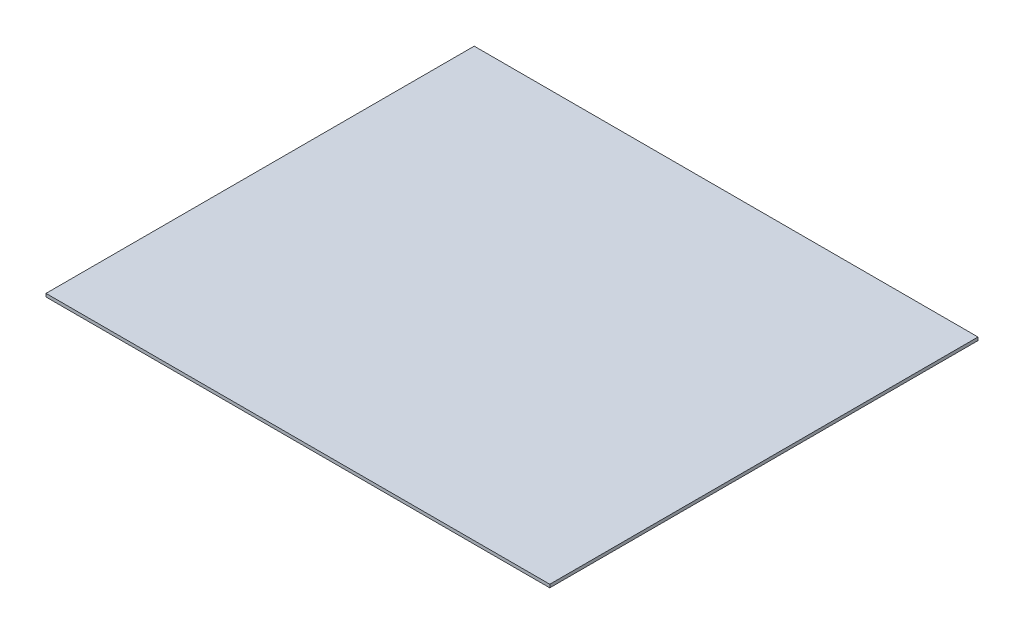
ISO-10303-21;
HEADER;
FILE_DESCRIPTION(('STEP AP214'),'2;1');
FILE_NAME('part.step','',(''),(''),'','','');
FILE_SCHEMA(('AUTOMOTIVE_DESIGN { 1 0 10303 214 1 1 1 1 }'));
ENDSEC;
DATA;
#1=APPLICATION_CONTEXT('core data for automotive mechanical design processes');
#2=APPLICATION_PROTOCOL_DEFINITION('international standard','automotive_design',2000,#1);
#3=PRODUCT_CONTEXT('',#1,'mechanical');
#4=PRODUCT('Part','Part','',(#3));
#5=PRODUCT_RELATED_PRODUCT_CATEGORY('part','',(#4));
#6=PRODUCT_DEFINITION_FORMATION('','',#4);
#7=PRODUCT_DEFINITION_CONTEXT('part definition',#1,'design');
#8=PRODUCT_DEFINITION('design','',#6,#7);
#9=PRODUCT_DEFINITION_SHAPE('','',#8);
#10=(LENGTH_UNIT() NAMED_UNIT(*) SI_UNIT(.MILLI.,.METRE.));
#11=(NAMED_UNIT(*) PLANE_ANGLE_UNIT() SI_UNIT($,.RADIAN.));
#12=(NAMED_UNIT(*) SI_UNIT($,.STERADIAN.) SOLID_ANGLE_UNIT());
#13=UNCERTAINTY_MEASURE_WITH_UNIT(LENGTH_MEASURE(1.E-05),#10,'distance_accuracy_value','');
#14=(GEOMETRIC_REPRESENTATION_CONTEXT(3) GLOBAL_UNCERTAINTY_ASSIGNED_CONTEXT((#13)) GLOBAL_UNIT_ASSIGNED_CONTEXT((#10,
#11,#12)) REPRESENTATION_CONTEXT('',''));
#15=CARTESIAN_POINT('',(0.,0.,0.));
#16=DIRECTION('',(0.,0.,1.));
#17=DIRECTION('',(1.,0.,0.));
#18=AXIS2_PLACEMENT_3D('',#15,#16,#17);
#19=CARTESIAN_POINT('',(381.,4.7625,323.85));
#20=DIRECTION('',(-1.,0.,0.));
#21=DIRECTION('',(0.,0.,1.));
#22=AXIS2_PLACEMENT_3D('',#19,#20,#21);
#23=PLANE('',#22);
#24=DIRECTION('',(0.,0.,-1.));
#25=VECTOR('',#24,1.);
#26=CARTESIAN_POINT('',(381.,0.,323.85));
#27=LINE('',#26,#25);
#28=CARTESIAN_POINT('',(381.,0.,323.85));
#29=VERTEX_POINT('',#28);
#30=CARTESIAN_POINT('',(381.,0.,-323.85));
#31=VERTEX_POINT('',#30);
#32=EDGE_CURVE('E96',#29,#31,#27,.T.);
#33=ORIENTED_EDGE('',*,*,#32,.T.);
#34=DIRECTION('',(0.,-1.,0.));
#35=VECTOR('',#34,1.);
#36=CARTESIAN_POINT('',(381.,4.7625,-323.85));
#37=LINE('',#36,#35);
#38=CARTESIAN_POINT('',(381.,4.7625,-323.85));
#39=VERTEX_POINT('',#38);
#40=EDGE_CURVE('E11',#39,#31,#37,.T.);
#41=ORIENTED_EDGE('',*,*,#40,.F.);
#42=DIRECTION('',(0.,0.,-1.));
#43=VECTOR('',#42,1.);
#44=CARTESIAN_POINT('',(381.,4.7625,323.85));
#45=LINE('',#44,#43);
#46=CARTESIAN_POINT('',(381.,4.7625,323.85));
#47=VERTEX_POINT('',#46);
#48=EDGE_CURVE('E84',#47,#39,#45,.T.);
#49=ORIENTED_EDGE('',*,*,#48,.F.);
#50=DIRECTION('',(0.,-1.,0.));
#51=VECTOR('',#50,1.);
#52=CARTESIAN_POINT('',(381.,4.7625,323.85));
#53=LINE('',#52,#51);
#54=EDGE_CURVE('E92',#47,#29,#53,.T.);
#55=ORIENTED_EDGE('',*,*,#54,.T.);
#56=EDGE_LOOP('',(#33,#41,#49,#55));
#57=FACE_BOUND('',#56,.T.);
#58=ADVANCED_FACE('F33',(#57),#23,.F.);
#59=CARTESIAN_POINT('',(-381.,4.7625,-323.85));
#60=DIRECTION('',(0.,0.,1.));
#61=DIRECTION('',(1.,0.,0.));
#62=AXIS2_PLACEMENT_3D('',#59,#60,#61);
#63=PLANE('',#62);
#64=DIRECTION('',(-1.,0.,0.));
#65=VECTOR('',#64,1.);
#66=CARTESIAN_POINT('',(-381.,0.,-323.85));
#67=LINE('',#66,#65);
#68=CARTESIAN_POINT('',(-381.,0.,-323.85));
#69=VERTEX_POINT('',#68);
#70=EDGE_CURVE('E88',#31,#69,#67,.T.);
#71=ORIENTED_EDGE('',*,*,#70,.T.);
#72=DIRECTION('',(0.,-1.,0.));
#73=VECTOR('',#72,1.);
#74=CARTESIAN_POINT('',(-381.,4.7625,-323.85));
#75=LINE('',#74,#73);
#76=CARTESIAN_POINT('',(-381.,4.7625,-323.85));
#77=VERTEX_POINT('',#76);
#78=EDGE_CURVE('E41',#77,#69,#75,.T.);
#79=ORIENTED_EDGE('',*,*,#78,.F.);
#80=DIRECTION('',(-1.,0.,0.));
#81=VECTOR('',#80,1.);
#82=CARTESIAN_POINT('',(-381.,4.7625,-323.85));
#83=LINE('',#82,#81);
#84=EDGE_CURVE('E79',#39,#77,#83,.T.);
#85=ORIENTED_EDGE('',*,*,#84,.F.);
#86=ORIENTED_EDGE('',*,*,#40,.T.);
#87=EDGE_LOOP('',(#71,#79,#85,#86));
#88=FACE_BOUND('',#87,.T.);
#89=ADVANCED_FACE('F87',(#88),#63,.F.);
#90=CARTESIAN_POINT('',(-381.,4.7625,323.85));
#91=DIRECTION('',(1.,0.,0.));
#92=DIRECTION('',(0.,0.,-1.));
#93=AXIS2_PLACEMENT_3D('',#90,#91,#92);
#94=PLANE('',#93);
#95=DIRECTION('',(0.,0.,1.));
#96=VECTOR('',#95,1.);
#97=CARTESIAN_POINT('',(-381.,0.,323.85));
#98=LINE('',#97,#96);
#99=CARTESIAN_POINT('',(-381.,0.,323.85));
#100=VERTEX_POINT('',#99);
#101=EDGE_CURVE('E66',#69,#100,#98,.T.);
#102=ORIENTED_EDGE('',*,*,#101,.T.);
#103=DIRECTION('',(0.,-1.,0.));
#104=VECTOR('',#103,1.);
#105=CARTESIAN_POINT('',(-381.,4.7625,323.85));
#106=LINE('',#105,#104);
#107=CARTESIAN_POINT('',(-381.,4.7625,323.85));
#108=VERTEX_POINT('',#107);
#109=EDGE_CURVE('E89',#108,#100,#106,.T.);
#110=ORIENTED_EDGE('',*,*,#109,.F.);
#111=DIRECTION('',(0.,0.,1.));
#112=VECTOR('',#111,1.);
#113=CARTESIAN_POINT('',(-381.,4.7625,323.85));
#114=LINE('',#113,#112);
#115=EDGE_CURVE('E82',#77,#108,#114,.T.);
#116=ORIENTED_EDGE('',*,*,#115,.F.);
#117=ORIENTED_EDGE('',*,*,#78,.T.);
#118=EDGE_LOOP('',(#102,#110,#116,#117));
#119=FACE_BOUND('',#118,.T.);
#120=ADVANCED_FACE('F90',(#119),#94,.F.);
#121=CARTESIAN_POINT('',(-381.,4.7625,323.85));
#122=DIRECTION('',(0.,0.,-1.));
#123=DIRECTION('',(-1.,0.,0.));
#124=AXIS2_PLACEMENT_3D('',#121,#122,#123);
#125=PLANE('',#124);
#126=DIRECTION('',(1.,0.,0.));
#127=VECTOR('',#126,1.);
#128=CARTESIAN_POINT('',(-381.,0.,323.85));
#129=LINE('',#128,#127);
#130=EDGE_CURVE('E72',#100,#29,#129,.T.);
#131=ORIENTED_EDGE('',*,*,#130,.T.);
#132=ORIENTED_EDGE('',*,*,#54,.F.);
#133=DIRECTION('',(1.,0.,0.));
#134=VECTOR('',#133,1.);
#135=CARTESIAN_POINT('',(-381.,4.7625,323.85));
#136=LINE('',#135,#134);
#137=EDGE_CURVE('E49',#108,#47,#136,.T.);
#138=ORIENTED_EDGE('',*,*,#137,.F.);
#139=ORIENTED_EDGE('',*,*,#109,.T.);
#140=EDGE_LOOP('',(#131,#132,#138,#139));
#141=FACE_BOUND('',#140,.T.);
#142=ADVANCED_FACE('F103',(#141),#125,.F.);
#143=CARTESIAN_POINT('',(0.,4.7625,0.));
#144=DIRECTION('',(0.,-1.,0.));
#145=DIRECTION('',(0.,0.,-1.));
#146=AXIS2_PLACEMENT_3D('',#143,#144,#145);
#147=PLANE('',#146);
#148=ORIENTED_EDGE('',*,*,#48,.T.);
#149=ORIENTED_EDGE('',*,*,#84,.T.);
#150=ORIENTED_EDGE('',*,*,#115,.T.);
#151=ORIENTED_EDGE('',*,*,#137,.T.);
#152=EDGE_LOOP('',(#148,#149,#150,#151));
#153=FACE_BOUND('',#152,.T.);
#154=ADVANCED_FACE('F80',(#153),#147,.F.);
#155=CARTESIAN_POINT('',(0.,0.,0.));
#156=DIRECTION('',(0.,-1.,0.));
#157=DIRECTION('',(0.,0.,-1.));
#158=AXIS2_PLACEMENT_3D('',#155,#156,#157);
#159=PLANE('',#158);
#160=ORIENTED_EDGE('',*,*,#32,.F.);
#161=ORIENTED_EDGE('',*,*,#130,.F.);
#162=ORIENTED_EDGE('',*,*,#101,.F.);
#163=ORIENTED_EDGE('',*,*,#70,.F.);
#164=EDGE_LOOP('',(#160,#161,#162,#163));
#165=FACE_BOUND('',#164,.T.);
#166=ADVANCED_FACE('F106',(#165),#159,.T.);
#167=CLOSED_SHELL('',(#58,#89,#120,#142,#154,#166));
#168=MANIFOLD_SOLID_BREP('B2',#167);
#169=ADVANCED_BREP_SHAPE_REPRESENTATION('',(#18,#168),#14);
#170=SHAPE_DEFINITION_REPRESENTATION(#9,#169);
ENDSEC;
END-ISO-10303-21;
